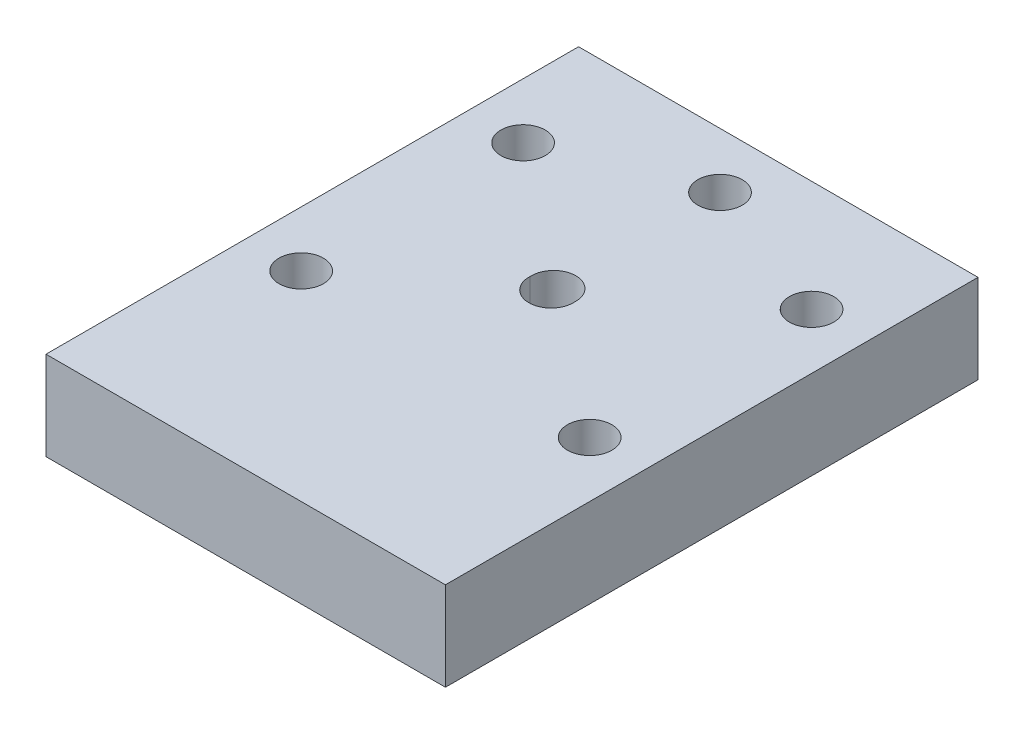
ISO-10303-21;
HEADER;
FILE_DESCRIPTION(('STEP AP214'),'2;1');
FILE_NAME('part.step','',(''),(''),'','','');
FILE_SCHEMA(('AUTOMOTIVE_DESIGN { 1 0 10303 214 1 1 1 1 }'));
ENDSEC;
DATA;
#1=APPLICATION_CONTEXT('core data for automotive mechanical design processes');
#2=APPLICATION_PROTOCOL_DEFINITION('international standard','automotive_design',2000,#1);
#3=PRODUCT_CONTEXT('',#1,'mechanical');
#4=PRODUCT('Part','Part','',(#3));
#5=PRODUCT_RELATED_PRODUCT_CATEGORY('part','',(#4));
#6=PRODUCT_DEFINITION_FORMATION('','',#4);
#7=PRODUCT_DEFINITION_CONTEXT('part definition',#1,'design');
#8=PRODUCT_DEFINITION('design','',#6,#7);
#9=PRODUCT_DEFINITION_SHAPE('','',#8);
#10=(LENGTH_UNIT() NAMED_UNIT(*) SI_UNIT(.MILLI.,.METRE.));
#11=(NAMED_UNIT(*) PLANE_ANGLE_UNIT() SI_UNIT($,.RADIAN.));
#12=(NAMED_UNIT(*) SI_UNIT($,.STERADIAN.) SOLID_ANGLE_UNIT());
#13=UNCERTAINTY_MEASURE_WITH_UNIT(LENGTH_MEASURE(1.E-05),#10,'distance_accuracy_value','');
#14=(GEOMETRIC_REPRESENTATION_CONTEXT(3) GLOBAL_UNCERTAINTY_ASSIGNED_CONTEXT((#13)) GLOBAL_UNIT_ASSIGNED_CONTEXT((#10,
#11,#12)) REPRESENTATION_CONTEXT('',''));
#15=CARTESIAN_POINT('',(0.,0.,0.));
#16=DIRECTION('',(0.,0.,1.));
#17=DIRECTION('',(1.,0.,0.));
#18=AXIS2_PLACEMENT_3D('',#15,#16,#17);
#19=CARTESIAN_POINT('',(0.,0.,0.));
#20=DIRECTION('',(0.,-1.,0.));
#21=DIRECTION('',(0.,0.,-1.));
#22=AXIS2_PLACEMENT_3D('',#19,#20,#21);
#23=PLANE('',#22);
#24=CARTESIAN_POINT('',(-5.17072499727675,0.,7.22));
#25=DIRECTION('',(0.,1.,0.));
#26=DIRECTION('',(0.,0.,1.));
#27=AXIS2_PLACEMENT_3D('',#24,#25,#26);
#28=CIRCLE('',#27,2.);
#29=CARTESIAN_POINT('',(-3.17396315963547,0.,7.333763631005));
#30=VERTEX_POINT('',#29);
#31=CARTESIAN_POINT('',(-7.16748683491802,0.,7.333763631005));
#32=VERTEX_POINT('',#31);
#33=EDGE_CURVE('E101',#30,#32,#28,.T.);
#34=ORIENTED_EDGE('',*,*,#33,.T.);
#35=CARTESIAN_POINT('',(-5.17072499727675,0.,7.44752726200999));
#36=DIRECTION('',(0.,1.,0.));
#37=DIRECTION('',(0.,0.,1.));
#38=AXIS2_PLACEMENT_3D('',#35,#36,#37);
#39=CIRCLE('',#38,2.);
#40=EDGE_CURVE('E47',#32,#30,#39,.T.);
#41=ORIENTED_EDGE('',*,*,#40,.T.);
#42=EDGE_LOOP('',(#34,#41));
#43=FACE_BOUND('',#42,.T.);
#44=CARTESIAN_POINT('',(-17.9199999999999,0.,-2.78));
#45=DIRECTION('',(0.,1.,0.));
#46=DIRECTION('',(0.,0.,1.));
#47=AXIS2_PLACEMENT_3D('',#44,#45,#46);
#48=CIRCLE('',#47,2.);
#49=CARTESIAN_POINT('',(-17.9199999999999,0.,-0.780000000000001));
#50=VERTEX_POINT('',#49);
#51=EDGE_CURVE('E107',#50,#50,#48,.T.);
#52=ORIENTED_EDGE('',*,*,#51,.T.);
#53=EDGE_LOOP('',(#52));
#54=FACE_BOUND('',#53,.T.);
#55=DIRECTION('',(1.,0.,0.));
#56=VECTOR('',#55,1.);
#57=CARTESIAN_POINT('',(-22.92,0.,35.22));
#58=LINE('',#57,#56);
#59=CARTESIAN_POINT('',(-22.92,0.,35.22));
#60=VERTEX_POINT('',#59);
#61=CARTESIAN_POINT('',(13.08,0.,35.22));
#62=VERTEX_POINT('',#61);
#63=EDGE_CURVE('E134',#60,#62,#58,.T.);
#64=ORIENTED_EDGE('',*,*,#63,.F.);
#65=DIRECTION('',(0.,0.,1.));
#66=VECTOR('',#65,1.);
#67=CARTESIAN_POINT('',(-22.92,0.,-12.78));
#68=LINE('',#67,#66);
#69=CARTESIAN_POINT('',(-22.92,0.,-12.78));
#70=VERTEX_POINT('',#69);
#71=EDGE_CURVE('E77',#70,#60,#68,.T.);
#72=ORIENTED_EDGE('',*,*,#71,.F.);
#73=DIRECTION('',(1.,0.,0.));
#74=VECTOR('',#73,1.);
#75=CARTESIAN_POINT('',(-22.92,0.,-12.78));
#76=LINE('',#75,#74);
#77=CARTESIAN_POINT('',(13.08,0.,-12.78));
#78=VERTEX_POINT('',#77);
#79=EDGE_CURVE('E149',#70,#78,#76,.T.);
#80=ORIENTED_EDGE('',*,*,#79,.T.);
#81=DIRECTION('',(0.,0.,1.));
#82=VECTOR('',#81,1.);
#83=CARTESIAN_POINT('',(13.08,0.,-12.78));
#84=LINE('',#83,#82);
#85=EDGE_CURVE('E146',#78,#62,#84,.T.);
#86=ORIENTED_EDGE('',*,*,#85,.T.);
#87=EDGE_LOOP('',(#64,#72,#80,#86));
#88=FACE_BOUND('',#87,.T.);
#89=CARTESIAN_POINT('',(-17.9199999999999,0.,17.22));
#90=DIRECTION('',(0.,1.,0.));
#91=DIRECTION('',(0.,0.,1.));
#92=AXIS2_PLACEMENT_3D('',#89,#90,#91);
#93=CIRCLE('',#92,2.);
#94=CARTESIAN_POINT('',(-17.9199999999999,0.,19.22));
#95=VERTEX_POINT('',#94);
#96=EDGE_CURVE('E128',#95,#95,#93,.T.);
#97=ORIENTED_EDGE('',*,*,#96,.T.);
#98=EDGE_LOOP('',(#97));
#99=FACE_BOUND('',#98,.T.);
#100=CARTESIAN_POINT('',(8.0800000000001,0.,17.22));
#101=DIRECTION('',(0.,1.,0.));
#102=DIRECTION('',(0.,0.,1.));
#103=AXIS2_PLACEMENT_3D('',#100,#101,#102);
#104=CIRCLE('',#103,2.);
#105=CARTESIAN_POINT('',(8.0800000000001,0.,19.22));
#106=VERTEX_POINT('',#105);
#107=EDGE_CURVE('E122',#106,#106,#104,.T.);
#108=ORIENTED_EDGE('',*,*,#107,.T.);
#109=EDGE_LOOP('',(#108));
#110=FACE_BOUND('',#109,.T.);
#111=CARTESIAN_POINT('',(8.0800000000001,0.,-2.78));
#112=DIRECTION('',(0.,1.,0.));
#113=DIRECTION('',(0.,0.,1.));
#114=AXIS2_PLACEMENT_3D('',#111,#112,#113);
#115=CIRCLE('',#114,2.);
#116=CARTESIAN_POINT('',(8.0800000000001,0.,-0.779999999999999));
#117=VERTEX_POINT('',#116);
#118=EDGE_CURVE('E116',#117,#117,#115,.T.);
#119=ORIENTED_EDGE('',*,*,#118,.T.);
#120=EDGE_LOOP('',(#119));
#121=FACE_BOUND('',#120,.T.);
#122=CARTESIAN_POINT('',(-5.17072499727675,0.,-7.78));
#123=DIRECTION('',(0.,1.,0.));
#124=DIRECTION('',(0.,0.,1.));
#125=AXIS2_PLACEMENT_3D('',#122,#123,#124);
#126=CIRCLE('',#125,2.);
#127=CARTESIAN_POINT('',(-5.17072499727675,0.,-5.78));
#128=VERTEX_POINT('',#127);
#129=EDGE_CURVE('E281',#128,#128,#126,.T.);
#130=ORIENTED_EDGE('',*,*,#129,.T.);
#131=EDGE_LOOP('',(#130));
#132=FACE_BOUND('',#131,.T.);
#133=ADVANCED_FACE('F32',(#43,#54,#88,#99,#110,#121,#132),#23,.T.);
#134=CARTESIAN_POINT('',(-22.92,8.,35.22));
#135=DIRECTION('',(0.,0.,-1.));
#136=DIRECTION('',(-1.,0.,0.));
#137=AXIS2_PLACEMENT_3D('',#134,#135,#136);
#138=PLANE('',#137);
#139=ORIENTED_EDGE('',*,*,#63,.T.);
#140=DIRECTION('',(0.,-1.,0.));
#141=VECTOR('',#140,1.);
#142=CARTESIAN_POINT('',(13.08,8.,35.22));
#143=LINE('',#142,#141);
#144=CARTESIAN_POINT('',(13.08,8.,35.22));
#145=VERTEX_POINT('',#144);
#146=EDGE_CURVE('E158',#145,#62,#143,.T.);
#147=ORIENTED_EDGE('',*,*,#146,.F.);
#148=DIRECTION('',(1.,0.,0.));
#149=VECTOR('',#148,1.);
#150=CARTESIAN_POINT('',(-22.92,8.,35.22));
#151=LINE('',#150,#149);
#152=CARTESIAN_POINT('',(-22.92,8.,35.22));
#153=VERTEX_POINT('',#152);
#154=EDGE_CURVE('E82',#153,#145,#151,.T.);
#155=ORIENTED_EDGE('',*,*,#154,.F.);
#156=DIRECTION('',(0.,-1.,0.));
#157=VECTOR('',#156,1.);
#158=CARTESIAN_POINT('',(-22.92,8.,35.22));
#159=LINE('',#158,#157);
#160=EDGE_CURVE('E143',#153,#60,#159,.T.);
#161=ORIENTED_EDGE('',*,*,#160,.T.);
#162=EDGE_LOOP('',(#139,#147,#155,#161));
#163=FACE_BOUND('',#162,.T.);
#164=ADVANCED_FACE('F34',(#163),#138,.F.);
#165=CARTESIAN_POINT('',(13.08,8.,-12.78));
#166=DIRECTION('',(1.,0.,0.));
#167=DIRECTION('',(0.,0.,-1.));
#168=AXIS2_PLACEMENT_3D('',#165,#166,#167);
#169=PLANE('',#168);
#170=ORIENTED_EDGE('',*,*,#85,.F.);
#171=DIRECTION('',(0.,-1.,0.));
#172=VECTOR('',#171,1.);
#173=CARTESIAN_POINT('',(13.08,8.,-12.78));
#174=LINE('',#173,#172);
#175=CARTESIAN_POINT('',(13.08,8.,-12.78));
#176=VERTEX_POINT('',#175);
#177=EDGE_CURVE('E156',#176,#78,#174,.T.);
#178=ORIENTED_EDGE('',*,*,#177,.F.);
#179=DIRECTION('',(0.,0.,1.));
#180=VECTOR('',#179,1.);
#181=CARTESIAN_POINT('',(13.08,8.,-12.78));
#182=LINE('',#181,#180);
#183=EDGE_CURVE('E136',#176,#145,#182,.T.);
#184=ORIENTED_EDGE('',*,*,#183,.T.);
#185=ORIENTED_EDGE('',*,*,#146,.T.);
#186=EDGE_LOOP('',(#170,#178,#184,#185));
#187=FACE_BOUND('',#186,.T.);
#188=ADVANCED_FACE('F161',(#187),#169,.T.);
#189=CARTESIAN_POINT('',(-22.92,8.,-12.78));
#190=DIRECTION('',(0.,0.,-1.));
#191=DIRECTION('',(-1.,0.,0.));
#192=AXIS2_PLACEMENT_3D('',#189,#190,#191);
#193=PLANE('',#192);
#194=ORIENTED_EDGE('',*,*,#79,.F.);
#195=DIRECTION('',(0.,-1.,0.));
#196=VECTOR('',#195,1.);
#197=CARTESIAN_POINT('',(-22.92,8.,-12.78));
#198=LINE('',#197,#196);
#199=CARTESIAN_POINT('',(-22.92,8.,-12.78));
#200=VERTEX_POINT('',#199);
#201=EDGE_CURVE('E154',#200,#70,#198,.T.);
#202=ORIENTED_EDGE('',*,*,#201,.F.);
#203=DIRECTION('',(1.,0.,0.));
#204=VECTOR('',#203,1.);
#205=CARTESIAN_POINT('',(-22.92,8.,-12.78));
#206=LINE('',#205,#204);
#207=EDGE_CURVE('E139',#200,#176,#206,.T.);
#208=ORIENTED_EDGE('',*,*,#207,.T.);
#209=ORIENTED_EDGE('',*,*,#177,.T.);
#210=EDGE_LOOP('',(#194,#202,#208,#209));
#211=FACE_BOUND('',#210,.T.);
#212=ADVANCED_FACE('F168',(#211),#193,.T.);
#213=CARTESIAN_POINT('',(-22.92,8.,-12.78));
#214=DIRECTION('',(1.,0.,0.));
#215=DIRECTION('',(0.,0.,-1.));
#216=AXIS2_PLACEMENT_3D('',#213,#214,#215);
#217=PLANE('',#216);
#218=ORIENTED_EDGE('',*,*,#71,.T.);
#219=ORIENTED_EDGE('',*,*,#160,.F.);
#220=DIRECTION('',(0.,0.,1.));
#221=VECTOR('',#220,1.);
#222=CARTESIAN_POINT('',(-22.92,8.,-12.78));
#223=LINE('',#222,#221);
#224=EDGE_CURVE('E56',#200,#153,#223,.T.);
#225=ORIENTED_EDGE('',*,*,#224,.F.);
#226=ORIENTED_EDGE('',*,*,#201,.T.);
#227=EDGE_LOOP('',(#218,#219,#225,#226));
#228=FACE_BOUND('',#227,.T.);
#229=ADVANCED_FACE('F172',(#228),#217,.F.);
#230=CARTESIAN_POINT('',(0.,8.,0.));
#231=DIRECTION('',(0.,-1.,0.));
#232=DIRECTION('',(0.,0.,-1.));
#233=AXIS2_PLACEMENT_3D('',#230,#231,#232);
#234=PLANE('',#233);
#235=CARTESIAN_POINT('',(-5.17072499727675,8.,-7.78));
#236=DIRECTION('',(0.,1.,0.));
#237=DIRECTION('',(0.,0.,1.));
#238=AXIS2_PLACEMENT_3D('',#235,#236,#237);
#239=CIRCLE('',#238,2.);
#240=CARTESIAN_POINT('',(-5.17072499727675,8.,-5.78));
#241=VERTEX_POINT('',#240);
#242=EDGE_CURVE('E102',#241,#241,#239,.T.);
#243=ORIENTED_EDGE('',*,*,#242,.F.);
#244=EDGE_LOOP('',(#243));
#245=FACE_BOUND('',#244,.T.);
#246=CARTESIAN_POINT('',(-5.17072499727675,8.,7.22));
#247=DIRECTION('',(0.,1.,0.));
#248=DIRECTION('',(0.,0.,1.));
#249=AXIS2_PLACEMENT_3D('',#246,#247,#248);
#250=CIRCLE('',#249,2.);
#251=CARTESIAN_POINT('',(-3.17396315963547,8.,7.333763631005));
#252=VERTEX_POINT('',#251);
#253=CARTESIAN_POINT('',(-7.16748683491802,8.,7.333763631005));
#254=VERTEX_POINT('',#253);
#255=EDGE_CURVE('E105',#252,#254,#250,.T.);
#256=ORIENTED_EDGE('',*,*,#255,.F.);
#257=CARTESIAN_POINT('',(-5.17072499727675,8.,7.44752726200999));
#258=DIRECTION('',(0.,1.,0.));
#259=DIRECTION('',(0.,0.,1.));
#260=AXIS2_PLACEMENT_3D('',#257,#258,#259);
#261=CIRCLE('',#260,2.);
#262=EDGE_CURVE('E93',#254,#252,#261,.T.);
#263=ORIENTED_EDGE('',*,*,#262,.F.);
#264=EDGE_LOOP('',(#256,#263));
#265=FACE_BOUND('',#264,.T.);
#266=CARTESIAN_POINT('',(-17.9199999999999,8.,-2.78));
#267=DIRECTION('',(0.,1.,0.));
#268=DIRECTION('',(0.,0.,1.));
#269=AXIS2_PLACEMENT_3D('',#266,#267,#268);
#270=CIRCLE('',#269,2.);
#271=CARTESIAN_POINT('',(-17.9199999999999,8.,-0.779999999999998));
#272=VERTEX_POINT('',#271);
#273=EDGE_CURVE('E113',#272,#272,#270,.T.);
#274=ORIENTED_EDGE('',*,*,#273,.F.);
#275=EDGE_LOOP('',(#274));
#276=FACE_BOUND('',#275,.T.);
#277=CARTESIAN_POINT('',(8.0800000000001,8.,-2.78));
#278=DIRECTION('',(0.,1.,0.));
#279=DIRECTION('',(0.,0.,1.));
#280=AXIS2_PLACEMENT_3D('',#277,#278,#279);
#281=CIRCLE('',#280,2.);
#282=CARTESIAN_POINT('',(8.0800000000001,8.,-0.779999999999999));
#283=VERTEX_POINT('',#282);
#284=EDGE_CURVE('E119',#283,#283,#281,.T.);
#285=ORIENTED_EDGE('',*,*,#284,.F.);
#286=EDGE_LOOP('',(#285));
#287=FACE_BOUND('',#286,.T.);
#288=CARTESIAN_POINT('',(8.0800000000001,8.,17.22));
#289=DIRECTION('',(0.,1.,0.));
#290=DIRECTION('',(0.,0.,1.));
#291=AXIS2_PLACEMENT_3D('',#288,#289,#290);
#292=CIRCLE('',#291,2.);
#293=CARTESIAN_POINT('',(8.0800000000001,8.,19.22));
#294=VERTEX_POINT('',#293);
#295=EDGE_CURVE('E125',#294,#294,#292,.T.);
#296=ORIENTED_EDGE('',*,*,#295,.F.);
#297=EDGE_LOOP('',(#296));
#298=FACE_BOUND('',#297,.T.);
#299=CARTESIAN_POINT('',(-17.9199999999999,8.,17.22));
#300=DIRECTION('',(0.,1.,0.));
#301=DIRECTION('',(0.,0.,1.));
#302=AXIS2_PLACEMENT_3D('',#299,#300,#301);
#303=CIRCLE('',#302,2.);
#304=CARTESIAN_POINT('',(-17.9199999999999,8.,19.22));
#305=VERTEX_POINT('',#304);
#306=EDGE_CURVE('E131',#305,#305,#303,.T.);
#307=ORIENTED_EDGE('',*,*,#306,.F.);
#308=EDGE_LOOP('',(#307));
#309=FACE_BOUND('',#308,.T.);
#310=ORIENTED_EDGE('',*,*,#154,.T.);
#311=ORIENTED_EDGE('',*,*,#183,.F.);
#312=ORIENTED_EDGE('',*,*,#207,.F.);
#313=ORIENTED_EDGE('',*,*,#224,.T.);
#314=EDGE_LOOP('',(#310,#311,#312,#313));
#315=FACE_BOUND('',#314,.T.);
#316=ADVANCED_FACE('F169',(#245,#265,#276,#287,#298,#309,#315),#234,.F.);
#317=CARTESIAN_POINT('',(-17.9199999999999,8.,17.22));
#318=DIRECTION('',(0.,1.,0.));
#319=DIRECTION('',(0.,0.,1.));
#320=AXIS2_PLACEMENT_3D('',#317,#318,#319);
#321=CYLINDRICAL_SURFACE('',#320,2.);
#322=ORIENTED_EDGE('',*,*,#96,.F.);
#323=EDGE_LOOP('',(#322));
#324=FACE_BOUND('',#323,.T.);
#325=ORIENTED_EDGE('',*,*,#306,.T.);
#326=EDGE_LOOP('',(#325));
#327=FACE_BOUND('',#326,.T.);
#328=ADVANCED_FACE('F171',(#324,#327),#321,.F.);
#329=CARTESIAN_POINT('',(8.0800000000001,8.,17.22));
#330=DIRECTION('',(0.,1.,0.));
#331=DIRECTION('',(0.,0.,1.));
#332=AXIS2_PLACEMENT_3D('',#329,#330,#331);
#333=CYLINDRICAL_SURFACE('',#332,2.);
#334=ORIENTED_EDGE('',*,*,#107,.F.);
#335=EDGE_LOOP('',(#334));
#336=FACE_BOUND('',#335,.T.);
#337=ORIENTED_EDGE('',*,*,#295,.T.);
#338=EDGE_LOOP('',(#337));
#339=FACE_BOUND('',#338,.T.);
#340=ADVANCED_FACE('F179',(#336,#339),#333,.F.);
#341=CARTESIAN_POINT('',(8.0800000000001,8.,-2.78));
#342=DIRECTION('',(0.,1.,0.));
#343=DIRECTION('',(0.,0.,1.));
#344=AXIS2_PLACEMENT_3D('',#341,#342,#343);
#345=CYLINDRICAL_SURFACE('',#344,2.);
#346=ORIENTED_EDGE('',*,*,#118,.F.);
#347=EDGE_LOOP('',(#346));
#348=FACE_BOUND('',#347,.T.);
#349=ORIENTED_EDGE('',*,*,#284,.T.);
#350=EDGE_LOOP('',(#349));
#351=FACE_BOUND('',#350,.T.);
#352=ADVANCED_FACE('F221',(#348,#351),#345,.F.);
#353=CARTESIAN_POINT('',(-17.9199999999999,8.,-2.78));
#354=DIRECTION('',(0.,1.,0.));
#355=DIRECTION('',(0.,0.,1.));
#356=AXIS2_PLACEMENT_3D('',#353,#354,#355);
#357=CYLINDRICAL_SURFACE('',#356,2.);
#358=ORIENTED_EDGE('',*,*,#51,.F.);
#359=EDGE_LOOP('',(#358));
#360=FACE_BOUND('',#359,.T.);
#361=ORIENTED_EDGE('',*,*,#273,.T.);
#362=EDGE_LOOP('',(#361));
#363=FACE_BOUND('',#362,.T.);
#364=ADVANCED_FACE('F231',(#360,#363),#357,.F.);
#365=CARTESIAN_POINT('',(-5.17072499727675,8.,7.22));
#366=DIRECTION('',(0.,1.,0.));
#367=DIRECTION('',(0.,0.,1.));
#368=AXIS2_PLACEMENT_3D('',#365,#366,#367);
#369=CYLINDRICAL_SURFACE('',#368,2.);
#370=ORIENTED_EDGE('',*,*,#33,.F.);
#371=DIRECTION('',(0.,1.,0.));
#372=VECTOR('',#371,1.);
#373=CARTESIAN_POINT('',(-3.17396315963547,4.,7.333763631005));
#374=LINE('',#373,#372);
#375=EDGE_CURVE('E11',#30,#252,#374,.T.);
#376=ORIENTED_EDGE('',*,*,#375,.T.);
#377=ORIENTED_EDGE('',*,*,#255,.T.);
#378=DIRECTION('',(0.,1.,0.));
#379=VECTOR('',#378,1.);
#380=CARTESIAN_POINT('',(-7.16748683491802,4.,7.333763631005));
#381=LINE('',#380,#379);
#382=EDGE_CURVE('E40',#254,#32,#381,.F.);
#383=ORIENTED_EDGE('',*,*,#382,.T.);
#384=EDGE_LOOP('',(#370,#376,#377,#383));
#385=FACE_BOUND('',#384,.T.);
#386=ADVANCED_FACE('F104',(#385),#369,.F.);
#387=CARTESIAN_POINT('',(-5.17072499727675,8.,7.44752726200999));
#388=DIRECTION('',(0.,1.,0.));
#389=DIRECTION('',(0.,0.,1.));
#390=AXIS2_PLACEMENT_3D('',#387,#388,#389);
#391=CYLINDRICAL_SURFACE('',#390,2.);
#392=ORIENTED_EDGE('',*,*,#40,.F.);
#393=ORIENTED_EDGE('',*,*,#382,.F.);
#394=ORIENTED_EDGE('',*,*,#262,.T.);
#395=ORIENTED_EDGE('',*,*,#375,.F.);
#396=EDGE_LOOP('',(#392,#393,#394,#395));
#397=FACE_BOUND('',#396,.T.);
#398=ADVANCED_FACE('F91',(#397),#391,.F.);
#399=CARTESIAN_POINT('',(-5.17072499727675,8.,-7.78));
#400=DIRECTION('',(0.,1.,0.));
#401=DIRECTION('',(0.,0.,1.));
#402=AXIS2_PLACEMENT_3D('',#399,#400,#401);
#403=CYLINDRICAL_SURFACE('',#402,2.);
#404=ORIENTED_EDGE('',*,*,#129,.F.);
#405=EDGE_LOOP('',(#404));
#406=FACE_BOUND('',#405,.T.);
#407=ORIENTED_EDGE('',*,*,#242,.T.);
#408=EDGE_LOOP('',(#407));
#409=FACE_BOUND('',#408,.T.);
#410=ADVANCED_FACE('F265',(#406,#409),#403,.F.);
#411=CLOSED_SHELL('',(#133,#164,#188,#212,#229,#316,#328,#340,#352,#364,#386,#398,#410));
#412=MANIFOLD_SOLID_BREP('B2',#411);
#413=ADVANCED_BREP_SHAPE_REPRESENTATION('',(#18,#412),#14);
#414=SHAPE_DEFINITION_REPRESENTATION(#9,#413);
ENDSEC;
END-ISO-10303-21;
